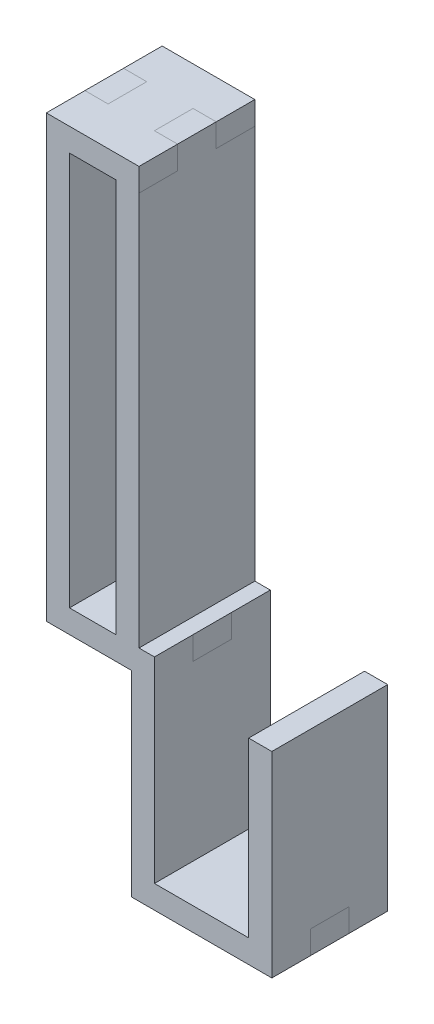
ISO-10303-21;
HEADER;
FILE_DESCRIPTION(('STEP AP214'),'2;1');
FILE_NAME('part.step','',(''),(''),'','','');
FILE_SCHEMA(('AUTOMOTIVE_DESIGN { 1 0 10303 214 1 1 1 1 }'));
ENDSEC;
DATA;
#1=APPLICATION_CONTEXT('core data for automotive mechanical design processes');
#2=APPLICATION_PROTOCOL_DEFINITION('international standard','automotive_design',2000,#1);
#3=PRODUCT_CONTEXT('',#1,'mechanical');
#4=PRODUCT('Part','Part','',(#3));
#5=PRODUCT_RELATED_PRODUCT_CATEGORY('part','',(#4));
#6=PRODUCT_DEFINITION_FORMATION('','',#4);
#7=PRODUCT_DEFINITION_CONTEXT('part definition',#1,'design');
#8=PRODUCT_DEFINITION('design','',#6,#7);
#9=PRODUCT_DEFINITION_SHAPE('','',#8);
#10=(LENGTH_UNIT() NAMED_UNIT(*) SI_UNIT(.MILLI.,.METRE.));
#11=(NAMED_UNIT(*) PLANE_ANGLE_UNIT() SI_UNIT($,.RADIAN.));
#12=(NAMED_UNIT(*) SI_UNIT($,.STERADIAN.) SOLID_ANGLE_UNIT());
#13=UNCERTAINTY_MEASURE_WITH_UNIT(LENGTH_MEASURE(1.E-05),#10,'distance_accuracy_value','');
#14=(GEOMETRIC_REPRESENTATION_CONTEXT(3) GLOBAL_UNCERTAINTY_ASSIGNED_CONTEXT((#13)) GLOBAL_UNIT_ASSIGNED_CONTEXT((#10,
#11,#12)) REPRESENTATION_CONTEXT('',''));
#15=CARTESIAN_POINT('',(0.,0.,0.));
#16=DIRECTION('',(0.,0.,1.));
#17=DIRECTION('',(1.,0.,0.));
#18=AXIS2_PLACEMENT_3D('',#15,#16,#17);
#19=CARTESIAN_POINT('',(75.7,0.,116.3));
#20=DIRECTION('',(1.,0.,0.));
#21=DIRECTION('',(0.,0.,-1.));
#22=AXIS2_PLACEMENT_3D('',#19,#20,#21);
#23=PLANE('',#22);
#24=DIRECTION('',(0.,1.,0.));
#25=VECTOR('',#24,1.);
#26=CARTESIAN_POINT('',(75.7,0.,116.3));
#27=LINE('',#26,#25);
#28=CARTESIAN_POINT('',(75.7,10.4122425773129,116.3));
#29=VERTEX_POINT('',#28);
#30=CARTESIAN_POINT('',(75.7,61.4122425773129,116.3));
#31=VERTEX_POINT('',#30);
#32=EDGE_CURVE('E325',#29,#31,#27,.T.);
#33=ORIENTED_EDGE('',*,*,#32,.T.);
#34=DIRECTION('',(0.,0.,1.));
#35=VECTOR('',#34,1.);
#36=CARTESIAN_POINT('',(75.7,61.4122425773129,116.3));
#37=LINE('',#36,#35);
#38=CARTESIAN_POINT('',(75.7,61.4122425773128,121.3));
#39=VERTEX_POINT('',#38);
#40=EDGE_CURVE('E11',#31,#39,#37,.T.);
#41=ORIENTED_EDGE('',*,*,#40,.T.);
#42=DIRECTION('',(0.,1.,0.));
#43=VECTOR('',#42,1.);
#44=CARTESIAN_POINT('',(75.7,0.,121.3));
#45=LINE('',#44,#43);
#46=CARTESIAN_POINT('',(75.7,64.4122425773129,121.3));
#47=VERTEX_POINT('',#46);
#48=EDGE_CURVE('E47',#39,#47,#45,.T.);
#49=ORIENTED_EDGE('',*,*,#48,.T.);
#50=DIRECTION('',(0.,0.,1.));
#51=VECTOR('',#50,1.);
#52=CARTESIAN_POINT('',(75.7,64.4122425773129,116.3));
#53=LINE('',#52,#51);
#54=CARTESIAN_POINT('',(75.7,64.4122425773129,126.3));
#55=VERTEX_POINT('',#54);
#56=EDGE_CURVE('E413',#47,#55,#53,.T.);
#57=ORIENTED_EDGE('',*,*,#56,.T.);
#58=DIRECTION('',(0.,-1.,0.));
#59=VECTOR('',#58,1.);
#60=CARTESIAN_POINT('',(75.7,0.,126.3));
#61=LINE('',#60,#59);
#62=CARTESIAN_POINT('',(75.7,61.4122425773128,126.3));
#63=VERTEX_POINT('',#62);
#64=EDGE_CURVE('E553',#55,#63,#61,.T.);
#65=ORIENTED_EDGE('',*,*,#64,.T.);
#66=DIRECTION('',(0.,0.,1.));
#67=VECTOR('',#66,1.);
#68=CARTESIAN_POINT('',(75.7,61.4122425773128,116.3));
#69=LINE('',#68,#67);
#70=CARTESIAN_POINT('',(75.7,61.4122425773129,131.3));
#71=VERTEX_POINT('',#70);
#72=EDGE_CURVE('E550',#63,#71,#69,.T.);
#73=ORIENTED_EDGE('',*,*,#72,.T.);
#74=DIRECTION('',(0.,1.,0.));
#75=VECTOR('',#74,1.);
#76=CARTESIAN_POINT('',(75.7,0.,131.3));
#77=LINE('',#76,#75);
#78=CARTESIAN_POINT('',(75.7,10.4122425773129,131.3));
#79=VERTEX_POINT('',#78);
#80=EDGE_CURVE('E369',#79,#71,#77,.T.);
#81=ORIENTED_EDGE('',*,*,#80,.F.);
#82=DIRECTION('',(0.,0.,1.));
#83=VECTOR('',#82,1.);
#84=CARTESIAN_POINT('',(75.7,10.4122425773129,116.3));
#85=LINE('',#84,#83);
#86=EDGE_CURVE('E415',#29,#79,#85,.T.);
#87=ORIENTED_EDGE('',*,*,#86,.F.);
#88=EDGE_LOOP('',(#33,#41,#49,#57,#65,#73,#81,#87));
#89=FACE_BOUND('',#88,.T.);
#90=ADVANCED_FACE('F38',(#89),#23,.T.);
#91=ORIENTED_EDGE('',*,*,#40,.F.);
#92=CARTESIAN_POINT('',(75.7,64.4122425773129,116.3));
#93=VERTEX_POINT('',#92);
#94=EDGE_CURVE('E324',#31,#93,#27,.T.);
#95=ORIENTED_EDGE('',*,*,#94,.T.);
#96=EDGE_CURVE('E410',#93,#47,#53,.T.);
#97=ORIENTED_EDGE('',*,*,#96,.T.);
#98=ORIENTED_EDGE('',*,*,#48,.F.);
#99=EDGE_LOOP('',(#91,#95,#97,#98));
#100=FACE_BOUND('',#99,.T.);
#101=ADVANCED_FACE('F568',(#100),#23,.T.);
#102=CARTESIAN_POINT('',(0.,64.4122425773129,116.3));
#103=DIRECTION('',(0.,1.,0.));
#104=DIRECTION('',(0.,0.,1.));
#105=AXIS2_PLACEMENT_3D('',#102,#103,#104);
#106=PLANE('',#105);
#107=DIRECTION('',(0.,0.,1.));
#108=VECTOR('',#107,1.);
#109=CARTESIAN_POINT('',(66.7,64.4122425773129,116.3));
#110=LINE('',#109,#108);
#111=CARTESIAN_POINT('',(66.7,64.4122425773129,121.3));
#112=VERTEX_POINT('',#111);
#113=CARTESIAN_POINT('',(66.7,64.4122425773129,126.3));
#114=VERTEX_POINT('',#113);
#115=EDGE_CURVE('E543',#112,#114,#110,.T.);
#116=ORIENTED_EDGE('',*,*,#115,.T.);
#117=DIRECTION('',(-1.,0.,0.));
#118=VECTOR('',#117,1.);
#119=CARTESIAN_POINT('',(0.,64.4122425773129,126.3));
#120=LINE('',#119,#118);
#121=CARTESIAN_POINT('',(63.7,64.4122425773129,126.3));
#122=VERTEX_POINT('',#121);
#123=EDGE_CURVE('E547',#114,#122,#120,.T.);
#124=ORIENTED_EDGE('',*,*,#123,.T.);
#125=DIRECTION('',(0.,0.,1.));
#126=VECTOR('',#125,1.);
#127=CARTESIAN_POINT('',(63.7,64.4122425773129,116.3));
#128=LINE('',#127,#126);
#129=CARTESIAN_POINT('',(63.7,64.4122425773129,131.3));
#130=VERTEX_POINT('',#129);
#131=EDGE_CURVE('E409',#122,#130,#128,.T.);
#132=ORIENTED_EDGE('',*,*,#131,.T.);
#133=DIRECTION('',(-1.,0.,0.));
#134=VECTOR('',#133,1.);
#135=CARTESIAN_POINT('',(0.,64.4122425773129,131.3));
#136=LINE('',#135,#134);
#137=CARTESIAN_POINT('',(75.7,64.4122425773129,131.3));
#138=VERTEX_POINT('',#137);
#139=EDGE_CURVE('E372',#138,#130,#136,.T.);
#140=ORIENTED_EDGE('',*,*,#139,.F.);
#141=EDGE_CURVE('E414',#55,#138,#53,.T.);
#142=ORIENTED_EDGE('',*,*,#141,.F.);
#143=DIRECTION('',(-1.,0.,0.));
#144=VECTOR('',#143,1.);
#145=CARTESIAN_POINT('',(0.,64.4122425773129,126.3));
#146=LINE('',#145,#144);
#147=CARTESIAN_POINT('',(72.7,64.4122425773129,126.3));
#148=VERTEX_POINT('',#147);
#149=EDGE_CURVE('E527',#55,#148,#146,.T.);
#150=ORIENTED_EDGE('',*,*,#149,.T.);
#151=DIRECTION('',(0.,0.,-1.));
#152=VECTOR('',#151,1.);
#153=CARTESIAN_POINT('',(72.7,64.4122425773129,116.3));
#154=LINE('',#153,#152);
#155=CARTESIAN_POINT('',(72.7,64.4122425773129,121.3));
#156=VERTEX_POINT('',#155);
#157=EDGE_CURVE('E531',#148,#156,#154,.T.);
#158=ORIENTED_EDGE('',*,*,#157,.T.);
#159=DIRECTION('',(1.,0.,0.));
#160=VECTOR('',#159,1.);
#161=CARTESIAN_POINT('',(0.,64.4122425773129,121.3));
#162=LINE('',#161,#160);
#163=EDGE_CURVE('E535',#156,#47,#162,.T.);
#164=ORIENTED_EDGE('',*,*,#163,.T.);
#165=ORIENTED_EDGE('',*,*,#96,.F.);
#166=DIRECTION('',(-1.,0.,0.));
#167=VECTOR('',#166,1.);
#168=CARTESIAN_POINT('',(0.,64.4122425773129,116.3));
#169=LINE('',#168,#167);
#170=CARTESIAN_POINT('',(63.7,64.4122425773129,116.3));
#171=VERTEX_POINT('',#170);
#172=EDGE_CURVE('E327',#93,#171,#169,.T.);
#173=ORIENTED_EDGE('',*,*,#172,.T.);
#174=CARTESIAN_POINT('',(63.7,64.4122425773129,121.3));
#175=VERTEX_POINT('',#174);
#176=EDGE_CURVE('E405',#171,#175,#128,.T.);
#177=ORIENTED_EDGE('',*,*,#176,.T.);
#178=DIRECTION('',(1.,0.,0.));
#179=VECTOR('',#178,1.);
#180=CARTESIAN_POINT('',(0.,64.4122425773129,121.3));
#181=LINE('',#180,#179);
#182=EDGE_CURVE('E539',#175,#112,#181,.T.);
#183=ORIENTED_EDGE('',*,*,#182,.T.);
#184=EDGE_LOOP('',(#116,#124,#132,#140,#142,#150,#158,#164,#165,#173,#177,#183));
#185=FACE_BOUND('',#184,.T.);
#186=ADVANCED_FACE('F562',(#185),#106,.T.);
#187=ORIENTED_EDGE('',*,*,#123,.F.);
#188=ORIENTED_EDGE('',*,*,#115,.F.);
#189=ORIENTED_EDGE('',*,*,#182,.F.);
#190=EDGE_CURVE('E408',#175,#122,#128,.T.);
#191=ORIENTED_EDGE('',*,*,#190,.T.);
#192=EDGE_LOOP('',(#187,#188,#189,#191));
#193=FACE_BOUND('',#192,.T.);
#194=ADVANCED_FACE('F646',(#193),#106,.T.);
#195=CARTESIAN_POINT('',(63.7,0.,116.3));
#196=DIRECTION('',(1.,0.,0.));
#197=DIRECTION('',(0.,0.,-1.));
#198=AXIS2_PLACEMENT_3D('',#195,#196,#197);
#199=PLANE('',#198);
#200=DIRECTION('',(0.,0.,-1.));
#201=VECTOR('',#200,1.);
#202=CARTESIAN_POINT('',(63.7,10.4122425773129,116.3));
#203=LINE('',#202,#201);
#204=CARTESIAN_POINT('',(63.7,10.4122425773129,131.3));
#205=VERTEX_POINT('',#204);
#206=CARTESIAN_POINT('',(63.7,10.4122425773129,126.3));
#207=VERTEX_POINT('',#206);
#208=EDGE_CURVE('E524',#205,#207,#203,.T.);
#209=ORIENTED_EDGE('',*,*,#208,.F.);
#210=DIRECTION('',(0.,1.,0.));
#211=VECTOR('',#210,1.);
#212=CARTESIAN_POINT('',(63.7,0.,131.3));
#213=LINE('',#212,#211);
#214=CARTESIAN_POINT('',(63.7,61.4122425773129,131.3));
#215=VERTEX_POINT('',#214);
#216=EDGE_CURVE('E380',#205,#215,#213,.T.);
#217=ORIENTED_EDGE('',*,*,#216,.T.);
#218=DIRECTION('',(0.,0.,1.));
#219=VECTOR('',#218,1.);
#220=CARTESIAN_POINT('',(63.7,61.4122425773128,116.3));
#221=LINE('',#220,#219);
#222=CARTESIAN_POINT('',(63.7,61.4122425773128,126.3));
#223=VERTEX_POINT('',#222);
#224=EDGE_CURVE('E501',#223,#215,#221,.T.);
#225=ORIENTED_EDGE('',*,*,#224,.F.);
#226=DIRECTION('',(0.,-1.,0.));
#227=VECTOR('',#226,1.);
#228=CARTESIAN_POINT('',(63.7,0.,126.3));
#229=LINE('',#228,#227);
#230=EDGE_CURVE('E505',#122,#223,#229,.T.);
#231=ORIENTED_EDGE('',*,*,#230,.F.);
#232=ORIENTED_EDGE('',*,*,#190,.F.);
#233=DIRECTION('',(0.,1.,0.));
#234=VECTOR('',#233,1.);
#235=CARTESIAN_POINT('',(63.7,0.,121.3));
#236=LINE('',#235,#234);
#237=CARTESIAN_POINT('',(63.7,61.4122425773128,121.3));
#238=VERTEX_POINT('',#237);
#239=EDGE_CURVE('E508',#238,#175,#236,.T.);
#240=ORIENTED_EDGE('',*,*,#239,.F.);
#241=DIRECTION('',(0.,0.,1.));
#242=VECTOR('',#241,1.);
#243=CARTESIAN_POINT('',(63.7,61.4122425773129,116.3));
#244=LINE('',#243,#242);
#245=CARTESIAN_POINT('',(63.7,61.4122425773129,116.3));
#246=VERTEX_POINT('',#245);
#247=EDGE_CURVE('E512',#246,#238,#244,.T.);
#248=ORIENTED_EDGE('',*,*,#247,.F.);
#249=DIRECTION('',(0.,1.,0.));
#250=VECTOR('',#249,1.);
#251=CARTESIAN_POINT('',(63.7,0.,116.3));
#252=LINE('',#251,#250);
#253=CARTESIAN_POINT('',(63.7,10.4122425773129,116.3));
#254=VERTEX_POINT('',#253);
#255=EDGE_CURVE('E334',#254,#246,#252,.T.);
#256=ORIENTED_EDGE('',*,*,#255,.F.);
#257=DIRECTION('',(0.,0.,-1.));
#258=VECTOR('',#257,1.);
#259=CARTESIAN_POINT('',(63.7,10.4122425773129,116.3));
#260=LINE('',#259,#258);
#261=CARTESIAN_POINT('',(63.7,10.4122425773129,121.3));
#262=VERTEX_POINT('',#261);
#263=EDGE_CURVE('E515',#262,#254,#260,.T.);
#264=ORIENTED_EDGE('',*,*,#263,.F.);
#265=DIRECTION('',(0.,1.,0.));
#266=VECTOR('',#265,1.);
#267=CARTESIAN_POINT('',(63.7,0.,121.3));
#268=LINE('',#267,#266);
#269=CARTESIAN_POINT('',(63.7,7.41224257731286,121.3));
#270=VERTEX_POINT('',#269);
#271=EDGE_CURVE('E518',#270,#262,#268,.T.);
#272=ORIENTED_EDGE('',*,*,#271,.F.);
#273=DIRECTION('',(0.,0.,1.));
#274=VECTOR('',#273,1.);
#275=CARTESIAN_POINT('',(63.7,7.41224257731286,116.3));
#276=LINE('',#275,#274);
#277=CARTESIAN_POINT('',(63.7,7.41224257731286,126.3));
#278=VERTEX_POINT('',#277);
#279=EDGE_CURVE('E403',#270,#278,#276,.T.);
#280=ORIENTED_EDGE('',*,*,#279,.T.);
#281=DIRECTION('',(0.,-1.,0.));
#282=VECTOR('',#281,1.);
#283=CARTESIAN_POINT('',(63.7,0.,126.3));
#284=LINE('',#283,#282);
#285=EDGE_CURVE('E521',#207,#278,#284,.T.);
#286=ORIENTED_EDGE('',*,*,#285,.F.);
#287=EDGE_LOOP('',(#209,#217,#225,#231,#232,#240,#248,#256,#264,#272,#280,#286));
#288=FACE_BOUND('',#287,.T.);
#289=ADVANCED_FACE('F632',(#288),#199,.F.);
#290=CARTESIAN_POINT('',(63.7,7.41224257731286,131.3));
#291=VERTEX_POINT('',#290);
#292=EDGE_CURVE('E376',#291,#205,#213,.T.);
#293=ORIENTED_EDGE('',*,*,#292,.T.);
#294=ORIENTED_EDGE('',*,*,#208,.T.);
#295=ORIENTED_EDGE('',*,*,#285,.T.);
#296=EDGE_CURVE('E404',#278,#291,#276,.T.);
#297=ORIENTED_EDGE('',*,*,#296,.T.);
#298=EDGE_LOOP('',(#293,#294,#295,#297));
#299=FACE_BOUND('',#298,.T.);
#300=ADVANCED_FACE('F830',(#299),#199,.F.);
#301=CARTESIAN_POINT('',(63.7,7.41224257731286,116.3));
#302=VERTEX_POINT('',#301);
#303=EDGE_CURVE('E294',#302,#270,#276,.T.);
#304=ORIENTED_EDGE('',*,*,#303,.T.);
#305=ORIENTED_EDGE('',*,*,#271,.T.);
#306=ORIENTED_EDGE('',*,*,#263,.T.);
#307=EDGE_CURVE('E331',#302,#254,#252,.T.);
#308=ORIENTED_EDGE('',*,*,#307,.F.);
#309=EDGE_LOOP('',(#304,#305,#306,#308));
#310=FACE_BOUND('',#309,.T.);
#311=ADVANCED_FACE('F636',(#310),#199,.F.);
#312=EDGE_CURVE('E330',#246,#171,#252,.T.);
#313=ORIENTED_EDGE('',*,*,#312,.F.);
#314=ORIENTED_EDGE('',*,*,#247,.T.);
#315=ORIENTED_EDGE('',*,*,#239,.T.);
#316=ORIENTED_EDGE('',*,*,#176,.F.);
#317=EDGE_LOOP('',(#313,#314,#315,#316));
#318=FACE_BOUND('',#317,.T.);
#319=ADVANCED_FACE('F643',(#318),#199,.F.);
#320=CARTESIAN_POINT('',(0.,-17.9877574226871,116.3));
#321=DIRECTION('',(0.,-1.,0.));
#322=DIRECTION('',(0.,0.,-1.));
#323=AXIS2_PLACEMENT_3D('',#320,#321,#322);
#324=PLANE('',#323);
#325=DIRECTION('',(0.,0.,-1.));
#326=VECTOR('',#325,1.);
#327=CARTESIAN_POINT('',(77.7,-17.9877574226871,116.3));
#328=LINE('',#327,#326);
#329=CARTESIAN_POINT('',(77.7,-17.9877574226871,131.3));
#330=VERTEX_POINT('',#329);
#331=CARTESIAN_POINT('',(77.7,-17.9877574226871,126.3));
#332=VERTEX_POINT('',#331);
#333=EDGE_CURVE('E494',#330,#332,#328,.T.);
#334=ORIENTED_EDGE('',*,*,#333,.T.);
#335=DIRECTION('',(-1.,0.,0.));
#336=VECTOR('',#335,1.);
#337=CARTESIAN_POINT('',(0.,-17.9877574226871,126.3));
#338=LINE('',#337,#336);
#339=CARTESIAN_POINT('',(74.7,-17.9877574226871,126.3));
#340=VERTEX_POINT('',#339);
#341=EDGE_CURVE('E498',#332,#340,#338,.T.);
#342=ORIENTED_EDGE('',*,*,#341,.T.);
#343=DIRECTION('',(0.,0.,1.));
#344=VECTOR('',#343,1.);
#345=CARTESIAN_POINT('',(74.7,-17.9877574226871,116.3));
#346=LINE('',#345,#344);
#347=CARTESIAN_POINT('',(74.7,-17.9877574226871,121.3));
#348=VERTEX_POINT('',#347);
#349=EDGE_CURVE('E438',#348,#340,#346,.T.);
#350=ORIENTED_EDGE('',*,*,#349,.F.);
#351=DIRECTION('',(1.,0.,0.));
#352=VECTOR('',#351,1.);
#353=CARTESIAN_POINT('',(0.,-17.9877574226871,121.3));
#354=LINE('',#353,#352);
#355=CARTESIAN_POINT('',(77.7,-17.9877574226871,121.3));
#356=VERTEX_POINT('',#355);
#357=EDGE_CURVE('E487',#348,#356,#354,.T.);
#358=ORIENTED_EDGE('',*,*,#357,.T.);
#359=DIRECTION('',(0.,0.,-1.));
#360=VECTOR('',#359,1.);
#361=CARTESIAN_POINT('',(77.7,-17.9877574226871,116.3));
#362=LINE('',#361,#360);
#363=CARTESIAN_POINT('',(77.7,-17.9877574226871,116.3));
#364=VERTEX_POINT('',#363);
#365=EDGE_CURVE('E491',#356,#364,#362,.T.);
#366=ORIENTED_EDGE('',*,*,#365,.T.);
#367=DIRECTION('',(1.,0.,0.));
#368=VECTOR('',#367,1.);
#369=CARTESIAN_POINT('',(0.,-17.9877574226871,116.3));
#370=LINE('',#369,#368);
#371=CARTESIAN_POINT('',(89.9,-17.9877574226871,116.3));
#372=VERTEX_POINT('',#371);
#373=EDGE_CURVE('E307',#364,#372,#370,.T.);
#374=ORIENTED_EDGE('',*,*,#373,.T.);
#375=DIRECTION('',(0.,0.,1.));
#376=VECTOR('',#375,1.);
#377=CARTESIAN_POINT('',(89.9,-17.9877574226871,116.3));
#378=LINE('',#377,#376);
#379=CARTESIAN_POINT('',(89.9,-17.9877574226871,121.3));
#380=VERTEX_POINT('',#379);
#381=EDGE_CURVE('E480',#372,#380,#378,.T.);
#382=ORIENTED_EDGE('',*,*,#381,.T.);
#383=DIRECTION('',(1.,0.,0.));
#384=VECTOR('',#383,1.);
#385=CARTESIAN_POINT('',(0.,-17.9877574226871,121.3));
#386=LINE('',#385,#384);
#387=CARTESIAN_POINT('',(92.9,-17.9877574226871,121.3));
#388=VERTEX_POINT('',#387);
#389=EDGE_CURVE('E484',#380,#388,#386,.T.);
#390=ORIENTED_EDGE('',*,*,#389,.T.);
#391=DIRECTION('',(0.,0.,1.));
#392=VECTOR('',#391,1.);
#393=CARTESIAN_POINT('',(92.9,-17.9877574226871,116.3));
#394=LINE('',#393,#392);
#395=CARTESIAN_POINT('',(92.9,-17.9877574226871,126.3));
#396=VERTEX_POINT('',#395);
#397=EDGE_CURVE('E435',#388,#396,#394,.T.);
#398=ORIENTED_EDGE('',*,*,#397,.T.);
#399=DIRECTION('',(-1.,0.,0.));
#400=VECTOR('',#399,1.);
#401=CARTESIAN_POINT('',(0.,-17.9877574226871,126.3));
#402=LINE('',#401,#400);
#403=CARTESIAN_POINT('',(89.9,-17.9877574226871,126.3));
#404=VERTEX_POINT('',#403);
#405=EDGE_CURVE('E472',#396,#404,#402,.T.);
#406=ORIENTED_EDGE('',*,*,#405,.T.);
#407=DIRECTION('',(0.,0.,1.));
#408=VECTOR('',#407,1.);
#409=CARTESIAN_POINT('',(89.9,-17.9877574226871,116.3));
#410=LINE('',#409,#408);
#411=CARTESIAN_POINT('',(89.9,-17.9877574226871,131.3));
#412=VERTEX_POINT('',#411);
#413=EDGE_CURVE('E476',#404,#412,#410,.T.);
#414=ORIENTED_EDGE('',*,*,#413,.T.);
#415=DIRECTION('',(1.,0.,0.));
#416=VECTOR('',#415,1.);
#417=CARTESIAN_POINT('',(0.,-17.9877574226871,131.3));
#418=LINE('',#417,#416);
#419=EDGE_CURVE('E352',#330,#412,#418,.T.);
#420=ORIENTED_EDGE('',*,*,#419,.F.);
#421=EDGE_LOOP('',(#334,#342,#350,#358,#366,#374,#382,#390,#398,#406,#414,#420));
#422=FACE_BOUND('',#421,.T.);
#423=ADVANCED_FACE('F616',(#422),#324,.T.);
#424=ORIENTED_EDGE('',*,*,#341,.F.);
#425=ORIENTED_EDGE('',*,*,#333,.F.);
#426=CARTESIAN_POINT('',(74.7,-17.9877574226871,131.3));
#427=VERTEX_POINT('',#426);
#428=EDGE_CURVE('E348',#427,#330,#418,.T.);
#429=ORIENTED_EDGE('',*,*,#428,.F.);
#430=EDGE_CURVE('E286',#340,#427,#346,.T.);
#431=ORIENTED_EDGE('',*,*,#430,.F.);
#432=EDGE_LOOP('',(#424,#425,#429,#431));
#433=FACE_BOUND('',#432,.T.);
#434=ADVANCED_FACE('F620',(#433),#324,.T.);
#435=ORIENTED_EDGE('',*,*,#365,.F.);
#436=ORIENTED_EDGE('',*,*,#357,.F.);
#437=CARTESIAN_POINT('',(74.7,-17.9877574226871,116.3));
#438=VERTEX_POINT('',#437);
#439=EDGE_CURVE('E437',#438,#348,#346,.T.);
#440=ORIENTED_EDGE('',*,*,#439,.F.);
#441=EDGE_CURVE('E304',#438,#364,#370,.T.);
#442=ORIENTED_EDGE('',*,*,#441,.T.);
#443=EDGE_LOOP('',(#435,#436,#440,#442));
#444=FACE_BOUND('',#443,.T.);
#445=ADVANCED_FACE('F610',(#444),#324,.T.);
#446=ORIENTED_EDGE('',*,*,#389,.F.);
#447=ORIENTED_EDGE('',*,*,#381,.F.);
#448=CARTESIAN_POINT('',(92.9,-17.9877574226871,116.3));
#449=VERTEX_POINT('',#448);
#450=EDGE_CURVE('E305',#372,#449,#370,.T.);
#451=ORIENTED_EDGE('',*,*,#450,.T.);
#452=EDGE_CURVE('E432',#449,#388,#394,.T.);
#453=ORIENTED_EDGE('',*,*,#452,.T.);
#454=EDGE_LOOP('',(#446,#447,#451,#453));
#455=FACE_BOUND('',#454,.T.);
#456=ADVANCED_FACE('F606',(#455),#324,.T.);
#457=CARTESIAN_POINT('',(92.9,0.,116.3));
#458=DIRECTION('',(1.,0.,0.));
#459=DIRECTION('',(0.,0.,-1.));
#460=AXIS2_PLACEMENT_3D('',#457,#458,#459);
#461=PLANE('',#460);
#462=CARTESIAN_POINT('',(92.9,-17.9877574226871,131.3));
#463=VERTEX_POINT('',#462);
#464=EDGE_CURVE('E436',#396,#463,#394,.T.);
#465=ORIENTED_EDGE('',*,*,#464,.F.);
#466=DIRECTION('',(0.,1.,0.));
#467=VECTOR('',#466,1.);
#468=CARTESIAN_POINT('',(92.9,0.,126.3));
#469=LINE('',#468,#467);
#470=CARTESIAN_POINT('',(92.9,-14.9877574226871,126.3));
#471=VERTEX_POINT('',#470);
#472=EDGE_CURVE('E469',#396,#471,#469,.T.);
#473=ORIENTED_EDGE('',*,*,#472,.T.);
#474=DIRECTION('',(0.,0.,-1.));
#475=VECTOR('',#474,1.);
#476=CARTESIAN_POINT('',(92.9,-14.9877574226871,116.3));
#477=LINE('',#476,#475);
#478=CARTESIAN_POINT('',(92.9,-14.9877574226871,121.3));
#479=VERTEX_POINT('',#478);
#480=EDGE_CURVE('E461',#471,#479,#477,.T.);
#481=ORIENTED_EDGE('',*,*,#480,.T.);
#482=DIRECTION('',(0.,-1.,0.));
#483=VECTOR('',#482,1.);
#484=CARTESIAN_POINT('',(92.9,0.,121.3));
#485=LINE('',#484,#483);
#486=EDGE_CURVE('E465',#479,#388,#485,.T.);
#487=ORIENTED_EDGE('',*,*,#486,.T.);
#488=ORIENTED_EDGE('',*,*,#452,.F.);
#489=DIRECTION('',(0.,1.,0.));
#490=VECTOR('',#489,1.);
#491=CARTESIAN_POINT('',(92.9,0.,116.3));
#492=LINE('',#491,#490);
#493=CARTESIAN_POINT('',(92.9,7.41224257731285,116.3));
#494=VERTEX_POINT('',#493);
#495=EDGE_CURVE('E310',#449,#494,#492,.T.);
#496=ORIENTED_EDGE('',*,*,#495,.T.);
#497=DIRECTION('',(0.,0.,1.));
#498=VECTOR('',#497,1.);
#499=CARTESIAN_POINT('',(92.9,7.41224257731285,116.3));
#500=LINE('',#499,#498);
#501=CARTESIAN_POINT('',(92.9,7.41224257731285,131.3));
#502=VERTEX_POINT('',#501);
#503=EDGE_CURVE('E430',#494,#502,#500,.T.);
#504=ORIENTED_EDGE('',*,*,#503,.T.);
#505=DIRECTION('',(0.,1.,0.));
#506=VECTOR('',#505,1.);
#507=CARTESIAN_POINT('',(92.9,0.,131.3));
#508=LINE('',#507,#506);
#509=EDGE_CURVE('E351',#463,#502,#508,.T.);
#510=ORIENTED_EDGE('',*,*,#509,.F.);
#511=EDGE_LOOP('',(#465,#473,#481,#487,#488,#496,#504,#510));
#512=FACE_BOUND('',#511,.T.);
#513=ADVANCED_FACE('F603',(#512),#461,.T.);
#514=CARTESIAN_POINT('',(77.7,0.,116.3));
#515=DIRECTION('',(-1.,0.,0.));
#516=DIRECTION('',(0.,-1.,0.));
#517=AXIS2_PLACEMENT_3D('',#514,#515,#516);
#518=PLANE('',#517);
#519=DIRECTION('',(0.,1.,0.));
#520=VECTOR('',#519,1.);
#521=CARTESIAN_POINT('',(77.7,0.,121.3));
#522=LINE('',#521,#520);
#523=CARTESIAN_POINT('',(77.7,7.41224257731285,121.3));
#524=VERTEX_POINT('',#523);
#525=CARTESIAN_POINT('',(77.7,10.4122425773129,121.3));
#526=VERTEX_POINT('',#525);
#527=EDGE_CURVE('E458',#524,#526,#522,.T.);
#528=ORIENTED_EDGE('',*,*,#527,.F.);
#529=DIRECTION('',(0.,0.,-1.));
#530=VECTOR('',#529,1.);
#531=CARTESIAN_POINT('',(77.7,7.41224257731285,116.3));
#532=LINE('',#531,#530);
#533=CARTESIAN_POINT('',(77.7,7.41224257731285,126.3));
#534=VERTEX_POINT('',#533);
#535=EDGE_CURVE('E454',#534,#524,#532,.T.);
#536=ORIENTED_EDGE('',*,*,#535,.F.);
#537=DIRECTION('',(0.,-1.,0.));
#538=VECTOR('',#537,1.);
#539=CARTESIAN_POINT('',(77.7,0.,126.3));
#540=LINE('',#539,#538);
#541=CARTESIAN_POINT('',(77.7,10.4122425773129,126.3));
#542=VERTEX_POINT('',#541);
#543=EDGE_CURVE('E448',#542,#534,#540,.T.);
#544=ORIENTED_EDGE('',*,*,#543,.F.);
#545=DIRECTION('',(0.,0.,1.));
#546=VECTOR('',#545,1.);
#547=CARTESIAN_POINT('',(77.7,10.4122425773129,116.3));
#548=LINE('',#547,#546);
#549=CARTESIAN_POINT('',(77.7,10.4122425773129,131.3));
#550=VERTEX_POINT('',#549);
#551=EDGE_CURVE('E421',#542,#550,#548,.T.);
#552=ORIENTED_EDGE('',*,*,#551,.T.);
#553=DIRECTION('',(0.,-1.,0.));
#554=VECTOR('',#553,1.);
#555=CARTESIAN_POINT('',(77.7,0.,131.3));
#556=LINE('',#555,#554);
#557=CARTESIAN_POINT('',(77.7,-14.9877574226871,131.3));
#558=VERTEX_POINT('',#557);
#559=EDGE_CURVE('E362',#550,#558,#556,.T.);
#560=ORIENTED_EDGE('',*,*,#559,.T.);
#561=DIRECTION('',(0.,0.,1.));
#562=VECTOR('',#561,1.);
#563=CARTESIAN_POINT('',(77.7,-14.9877574226871,116.3));
#564=LINE('',#563,#562);
#565=CARTESIAN_POINT('',(77.7,-14.9877574226871,116.3));
#566=VERTEX_POINT('',#565);
#567=EDGE_CURVE('E422',#566,#558,#564,.T.);
#568=ORIENTED_EDGE('',*,*,#567,.F.);
#569=DIRECTION('',(0.,-1.,0.));
#570=VECTOR('',#569,1.);
#571=CARTESIAN_POINT('',(77.7,0.,116.3));
#572=LINE('',#571,#570);
#573=CARTESIAN_POINT('',(77.7,10.4122425773129,116.3));
#574=VERTEX_POINT('',#573);
#575=EDGE_CURVE('E319',#574,#566,#572,.T.);
#576=ORIENTED_EDGE('',*,*,#575,.F.);
#577=EDGE_CURVE('E417',#574,#526,#548,.T.);
#578=ORIENTED_EDGE('',*,*,#577,.T.);
#579=EDGE_LOOP('',(#528,#536,#544,#552,#560,#568,#576,#578));
#580=FACE_BOUND('',#579,.T.);
#581=ADVANCED_FACE('F582',(#580),#518,.F.);
#582=CARTESIAN_POINT('',(74.7,0.,116.3));
#583=DIRECTION('',(-1.,0.,0.));
#584=DIRECTION('',(0.,0.,1.));
#585=AXIS2_PLACEMENT_3D('',#582,#583,#584);
#586=PLANE('',#585);
#587=DIRECTION('',(0.,0.,1.));
#588=VECTOR('',#587,1.);
#589=CARTESIAN_POINT('',(74.7,-14.9877574226871,116.3));
#590=LINE('',#589,#588);
#591=CARTESIAN_POINT('',(74.7,-14.9877574226871,121.3));
#592=VERTEX_POINT('',#591);
#593=CARTESIAN_POINT('',(74.7,-14.9877574226871,126.3));
#594=VERTEX_POINT('',#593);
#595=EDGE_CURVE('E443',#592,#594,#590,.T.);
#596=ORIENTED_EDGE('',*,*,#595,.T.);
#597=DIRECTION('',(0.,-1.,0.));
#598=VECTOR('',#597,1.);
#599=CARTESIAN_POINT('',(74.7,0.,126.3));
#600=LINE('',#599,#598);
#601=EDGE_CURVE('E444',#594,#340,#600,.T.);
#602=ORIENTED_EDGE('',*,*,#601,.T.);
#603=ORIENTED_EDGE('',*,*,#430,.T.);
#604=DIRECTION('',(0.,-1.,0.));
#605=VECTOR('',#604,1.);
#606=CARTESIAN_POINT('',(74.7,0.,131.3));
#607=LINE('',#606,#605);
#608=CARTESIAN_POINT('',(74.7,7.41224257731286,131.3));
#609=VERTEX_POINT('',#608);
#610=EDGE_CURVE('E282',#609,#427,#607,.T.);
#611=ORIENTED_EDGE('',*,*,#610,.F.);
#612=DIRECTION('',(0.,0.,1.));
#613=VECTOR('',#612,1.);
#614=CARTESIAN_POINT('',(74.7,7.41224257731286,116.3));
#615=LINE('',#614,#613);
#616=CARTESIAN_POINT('',(74.7,7.41224257731286,116.3));
#617=VERTEX_POINT('',#616);
#618=EDGE_CURVE('E274',#617,#609,#615,.T.);
#619=ORIENTED_EDGE('',*,*,#618,.F.);
#620=DIRECTION('',(0.,-1.,0.));
#621=VECTOR('',#620,1.);
#622=CARTESIAN_POINT('',(74.7,0.,116.3));
#623=LINE('',#622,#621);
#624=EDGE_CURVE('E280',#617,#438,#623,.T.);
#625=ORIENTED_EDGE('',*,*,#624,.T.);
#626=ORIENTED_EDGE('',*,*,#439,.T.);
#627=DIRECTION('',(0.,1.,0.));
#628=VECTOR('',#627,1.);
#629=CARTESIAN_POINT('',(74.7,0.,121.3));
#630=LINE('',#629,#628);
#631=EDGE_CURVE('E393',#348,#592,#630,.T.);
#632=ORIENTED_EDGE('',*,*,#631,.T.);
#633=EDGE_LOOP('',(#596,#602,#603,#611,#619,#625,#626,#632));
#634=FACE_BOUND('',#633,.T.);
#635=ADVANCED_FACE('F277',(#634),#586,.T.);
#636=CARTESIAN_POINT('',(0.,10.4122425773128,116.3));
#637=DIRECTION('',(0.,1.,0.));
#638=DIRECTION('',(-1.,0.,0.));
#639=AXIS2_PLACEMENT_3D('',#636,#637,#638);
#640=PLANE('',#639);
#641=DIRECTION('',(-1.,0.,0.));
#642=VECTOR('',#641,1.);
#643=CARTESIAN_POINT('',(0.,10.4122425773128,131.3));
#644=LINE('',#643,#642);
#645=CARTESIAN_POINT('',(72.7,10.4122425773129,131.3));
#646=VERTEX_POINT('',#645);
#647=CARTESIAN_POINT('',(66.7,10.4122425773129,131.3));
#648=VERTEX_POINT('',#647);
#649=EDGE_CURVE('E379',#646,#648,#644,.T.);
#650=ORIENTED_EDGE('',*,*,#649,.F.);
#651=DIRECTION('',(0.,0.,1.));
#652=VECTOR('',#651,1.);
#653=CARTESIAN_POINT('',(72.7,10.4122425773129,116.3));
#654=LINE('',#653,#652);
#655=CARTESIAN_POINT('',(72.7,10.4122425773129,116.3));
#656=VERTEX_POINT('',#655);
#657=EDGE_CURVE('E391',#656,#646,#654,.T.);
#658=ORIENTED_EDGE('',*,*,#657,.F.);
#659=DIRECTION('',(-1.,0.,0.));
#660=VECTOR('',#659,1.);
#661=CARTESIAN_POINT('',(0.,10.4122425773128,116.3));
#662=LINE('',#661,#660);
#663=CARTESIAN_POINT('',(66.7,10.4122425773129,116.3));
#664=VERTEX_POINT('',#663);
#665=EDGE_CURVE('E333',#656,#664,#662,.T.);
#666=ORIENTED_EDGE('',*,*,#665,.T.);
#667=DIRECTION('',(0.,0.,1.));
#668=VECTOR('',#667,1.);
#669=CARTESIAN_POINT('',(66.7,10.4122425773129,116.3));
#670=LINE('',#669,#668);
#671=EDGE_CURVE('E400',#664,#648,#670,.T.);
#672=ORIENTED_EDGE('',*,*,#671,.T.);
#673=EDGE_LOOP('',(#650,#658,#666,#672));
#674=FACE_BOUND('',#673,.T.);
#675=ADVANCED_FACE('F680',(#674),#640,.T.);
#676=CARTESIAN_POINT('',(72.7,0.,116.3));
#677=DIRECTION('',(1.,0.,0.));
#678=DIRECTION('',(0.,0.,-1.));
#679=AXIS2_PLACEMENT_3D('',#676,#677,#678);
#680=PLANE('',#679);
#681=DIRECTION('',(0.,1.,0.));
#682=VECTOR('',#681,1.);
#683=CARTESIAN_POINT('',(72.7,0.,131.3));
#684=LINE('',#683,#682);
#685=CARTESIAN_POINT('',(72.7,61.4122425773129,131.3));
#686=VERTEX_POINT('',#685);
#687=EDGE_CURVE('E297',#646,#686,#684,.T.);
#688=ORIENTED_EDGE('',*,*,#687,.T.);
#689=DIRECTION('',(0.,0.,1.));
#690=VECTOR('',#689,1.);
#691=CARTESIAN_POINT('',(72.7,61.4122425773129,116.3));
#692=LINE('',#691,#690);
#693=CARTESIAN_POINT('',(72.7,61.4122425773129,116.3));
#694=VERTEX_POINT('',#693);
#695=EDGE_CURVE('E394',#694,#686,#692,.T.);
#696=ORIENTED_EDGE('',*,*,#695,.F.);
#697=DIRECTION('',(0.,1.,0.));
#698=VECTOR('',#697,1.);
#699=CARTESIAN_POINT('',(72.7,0.,116.3));
#700=LINE('',#699,#698);
#701=EDGE_CURVE('E287',#656,#694,#700,.T.);
#702=ORIENTED_EDGE('',*,*,#701,.F.);
#703=ORIENTED_EDGE('',*,*,#657,.T.);
#704=EDGE_LOOP('',(#688,#696,#702,#703));
#705=FACE_BOUND('',#704,.T.);
#706=ADVANCED_FACE('F683',(#705),#680,.F.);
#707=CARTESIAN_POINT('',(0.,61.4122425773129,116.3));
#708=DIRECTION('',(0.,1.,0.));
#709=DIRECTION('',(0.,0.,1.));
#710=AXIS2_PLACEMENT_3D('',#707,#708,#709);
#711=PLANE('',#710);
#712=DIRECTION('',(-1.,0.,0.));
#713=VECTOR('',#712,1.);
#714=CARTESIAN_POINT('',(0.,61.4122425773129,131.3));
#715=LINE('',#714,#713);
#716=CARTESIAN_POINT('',(66.7,61.4122425773129,131.3));
#717=VERTEX_POINT('',#716);
#718=EDGE_CURVE('E386',#686,#717,#715,.T.);
#719=ORIENTED_EDGE('',*,*,#718,.T.);
#720=DIRECTION('',(0.,0.,1.));
#721=VECTOR('',#720,1.);
#722=CARTESIAN_POINT('',(66.7,61.4122425773129,116.3));
#723=LINE('',#722,#721);
#724=CARTESIAN_POINT('',(66.7,61.4122425773129,116.3));
#725=VERTEX_POINT('',#724);
#726=EDGE_CURVE('E397',#725,#717,#723,.T.);
#727=ORIENTED_EDGE('',*,*,#726,.F.);
#728=DIRECTION('',(-1.,0.,0.));
#729=VECTOR('',#728,1.);
#730=CARTESIAN_POINT('',(0.,61.4122425773129,116.3));
#731=LINE('',#730,#729);
#732=EDGE_CURVE('E339',#694,#725,#731,.T.);
#733=ORIENTED_EDGE('',*,*,#732,.F.);
#734=ORIENTED_EDGE('',*,*,#695,.T.);
#735=EDGE_LOOP('',(#719,#727,#733,#734));
#736=FACE_BOUND('',#735,.T.);
#737=ADVANCED_FACE('F689',(#736),#711,.F.);
#738=CARTESIAN_POINT('',(0.,7.41224257731284,116.3));
#739=DIRECTION('',(0.,1.,0.));
#740=DIRECTION('',(-1.,0.,0.));
#741=AXIS2_PLACEMENT_3D('',#738,#739,#740);
#742=PLANE('',#741);
#743=DIRECTION('',(-1.,0.,0.));
#744=VECTOR('',#743,1.);
#745=CARTESIAN_POINT('',(0.,7.41224257731284,131.3));
#746=LINE('',#745,#744);
#747=EDGE_CURVE('E344',#609,#291,#746,.T.);
#748=ORIENTED_EDGE('',*,*,#747,.T.);
#749=ORIENTED_EDGE('',*,*,#296,.F.);
#750=ORIENTED_EDGE('',*,*,#279,.F.);
#751=ORIENTED_EDGE('',*,*,#303,.F.);
#752=DIRECTION('',(-1.,0.,0.));
#753=VECTOR('',#752,1.);
#754=CARTESIAN_POINT('',(0.,7.41224257731284,116.3));
#755=LINE('',#754,#753);
#756=EDGE_CURVE('E291',#617,#302,#755,.T.);
#757=ORIENTED_EDGE('',*,*,#756,.F.);
#758=ORIENTED_EDGE('',*,*,#618,.T.);
#759=EDGE_LOOP('',(#748,#749,#750,#751,#757,#758));
#760=FACE_BOUND('',#759,.T.);
#761=ADVANCED_FACE('F40',(#760),#742,.F.);
#762=ORIENTED_EDGE('',*,*,#131,.F.);
#763=ORIENTED_EDGE('',*,*,#230,.T.);
#764=ORIENTED_EDGE('',*,*,#224,.T.);
#765=EDGE_CURVE('E375',#215,#130,#213,.T.);
#766=ORIENTED_EDGE('',*,*,#765,.T.);
#767=EDGE_LOOP('',(#762,#763,#764,#766));
#768=FACE_BOUND('',#767,.T.);
#769=ADVANCED_FACE('F653',(#768),#199,.F.);
#770=ORIENTED_EDGE('',*,*,#163,.F.);
#771=ORIENTED_EDGE('',*,*,#157,.F.);
#772=ORIENTED_EDGE('',*,*,#149,.F.);
#773=ORIENTED_EDGE('',*,*,#56,.F.);
#774=EDGE_LOOP('',(#770,#771,#772,#773));
#775=FACE_BOUND('',#774,.T.);
#776=ADVANCED_FACE('F566',(#775),#106,.T.);
#777=ORIENTED_EDGE('',*,*,#64,.F.);
#778=ORIENTED_EDGE('',*,*,#141,.T.);
#779=EDGE_CURVE('E368',#71,#138,#77,.T.);
#780=ORIENTED_EDGE('',*,*,#779,.F.);
#781=ORIENTED_EDGE('',*,*,#72,.F.);
#782=EDGE_LOOP('',(#777,#778,#780,#781));
#783=FACE_BOUND('',#782,.T.);
#784=ADVANCED_FACE('F659',(#783),#23,.T.);
#785=CARTESIAN_POINT('',(0.,10.412242577313,116.3));
#786=DIRECTION('',(0.,1.,0.));
#787=DIRECTION('',(-1.,0.,0.));
#788=AXIS2_PLACEMENT_3D('',#785,#786,#787);
#789=PLANE('',#788);
#790=DIRECTION('',(-1.,0.,0.));
#791=VECTOR('',#790,1.);
#792=CARTESIAN_POINT('',(0.,10.412242577313,131.3));
#793=LINE('',#792,#791);
#794=EDGE_CURVE('E365',#550,#79,#793,.T.);
#795=ORIENTED_EDGE('',*,*,#794,.F.);
#796=ORIENTED_EDGE('',*,*,#551,.F.);
#797=EDGE_CURVE('E420',#526,#542,#548,.T.);
#798=ORIENTED_EDGE('',*,*,#797,.F.);
#799=ORIENTED_EDGE('',*,*,#577,.F.);
#800=DIRECTION('',(-1.,0.,0.));
#801=VECTOR('',#800,1.);
#802=CARTESIAN_POINT('',(0.,10.412242577313,116.3));
#803=LINE('',#802,#801);
#804=EDGE_CURVE('E321',#574,#29,#803,.T.);
#805=ORIENTED_EDGE('',*,*,#804,.T.);
#806=ORIENTED_EDGE('',*,*,#86,.T.);
#807=EDGE_LOOP('',(#795,#796,#798,#799,#805,#806));
#808=FACE_BOUND('',#807,.T.);
#809=ADVANCED_FACE('F574',(#808),#789,.T.);
#810=ORIENTED_EDGE('',*,*,#535,.T.);
#811=ORIENTED_EDGE('',*,*,#527,.T.);
#812=ORIENTED_EDGE('',*,*,#797,.T.);
#813=ORIENTED_EDGE('',*,*,#543,.T.);
#814=EDGE_LOOP('',(#810,#811,#812,#813));
#815=FACE_BOUND('',#814,.T.);
#816=ADVANCED_FACE('F666',(#815),#518,.F.);
#817=CARTESIAN_POINT('',(0.,-14.9877574226871,116.3));
#818=DIRECTION('',(0.,-1.,0.));
#819=DIRECTION('',(1.,0.,0.));
#820=AXIS2_PLACEMENT_3D('',#817,#818,#819);
#821=PLANE('',#820);
#822=DIRECTION('',(1.,0.,0.));
#823=VECTOR('',#822,1.);
#824=CARTESIAN_POINT('',(0.,-14.9877574226871,131.3));
#825=LINE('',#824,#823);
#826=CARTESIAN_POINT('',(89.9,-14.9877574226871,131.3));
#827=VERTEX_POINT('',#826);
#828=EDGE_CURVE('E360',#558,#827,#825,.T.);
#829=ORIENTED_EDGE('',*,*,#828,.T.);
#830=DIRECTION('',(0.,0.,1.));
#831=VECTOR('',#830,1.);
#832=CARTESIAN_POINT('',(89.9,-14.9877574226871,116.3));
#833=LINE('',#832,#831);
#834=CARTESIAN_POINT('',(89.9,-14.9877574226871,116.3));
#835=VERTEX_POINT('',#834);
#836=EDGE_CURVE('E424',#835,#827,#833,.T.);
#837=ORIENTED_EDGE('',*,*,#836,.F.);
#838=DIRECTION('',(1.,0.,0.));
#839=VECTOR('',#838,1.);
#840=CARTESIAN_POINT('',(0.,-14.9877574226871,116.3));
#841=LINE('',#840,#839);
#842=EDGE_CURVE('E317',#566,#835,#841,.T.);
#843=ORIENTED_EDGE('',*,*,#842,.F.);
#844=ORIENTED_EDGE('',*,*,#567,.T.);
#845=EDGE_LOOP('',(#829,#837,#843,#844));
#846=FACE_BOUND('',#845,.T.);
#847=ADVANCED_FACE('F586',(#846),#821,.F.);
#848=CARTESIAN_POINT('',(89.9,0.,116.3));
#849=DIRECTION('',(1.,0.,0.));
#850=DIRECTION('',(0.,1.,0.));
#851=AXIS2_PLACEMENT_3D('',#848,#849,#850);
#852=PLANE('',#851);
#853=DIRECTION('',(0.,1.,0.));
#854=VECTOR('',#853,1.);
#855=CARTESIAN_POINT('',(89.9,0.,131.3));
#856=LINE('',#855,#854);
#857=CARTESIAN_POINT('',(89.9,7.41224257731285,131.3));
#858=VERTEX_POINT('',#857);
#859=EDGE_CURVE('E358',#827,#858,#856,.T.);
#860=ORIENTED_EDGE('',*,*,#859,.T.);
#861=DIRECTION('',(0.,0.,1.));
#862=VECTOR('',#861,1.);
#863=CARTESIAN_POINT('',(89.9,7.41224257731285,116.3));
#864=LINE('',#863,#862);
#865=CARTESIAN_POINT('',(89.9,7.41224257731285,116.3));
#866=VERTEX_POINT('',#865);
#867=EDGE_CURVE('E427',#866,#858,#864,.T.);
#868=ORIENTED_EDGE('',*,*,#867,.F.);
#869=DIRECTION('',(0.,1.,0.));
#870=VECTOR('',#869,1.);
#871=CARTESIAN_POINT('',(89.9,0.,116.3));
#872=LINE('',#871,#870);
#873=EDGE_CURVE('E315',#835,#866,#872,.T.);
#874=ORIENTED_EDGE('',*,*,#873,.F.);
#875=ORIENTED_EDGE('',*,*,#836,.T.);
#876=EDGE_LOOP('',(#860,#868,#874,#875));
#877=FACE_BOUND('',#876,.T.);
#878=ADVANCED_FACE('F591',(#877),#852,.F.);
#879=CARTESIAN_POINT('',(0.,7.41224257731288,116.3));
#880=DIRECTION('',(0.,-1.,0.));
#881=DIRECTION('',(1.,0.,0.));
#882=AXIS2_PLACEMENT_3D('',#879,#880,#881);
#883=PLANE('',#882);
#884=DIRECTION('',(1.,0.,0.));
#885=VECTOR('',#884,1.);
#886=CARTESIAN_POINT('',(0.,7.41224257731288,131.3));
#887=LINE('',#886,#885);
#888=EDGE_CURVE('E355',#858,#502,#887,.T.);
#889=ORIENTED_EDGE('',*,*,#888,.T.);
#890=ORIENTED_EDGE('',*,*,#503,.F.);
#891=DIRECTION('',(1.,0.,0.));
#892=VECTOR('',#891,1.);
#893=CARTESIAN_POINT('',(0.,7.41224257731288,116.3));
#894=LINE('',#893,#892);
#895=EDGE_CURVE('E313',#866,#494,#894,.T.);
#896=ORIENTED_EDGE('',*,*,#895,.F.);
#897=ORIENTED_EDGE('',*,*,#867,.T.);
#898=EDGE_LOOP('',(#889,#890,#896,#897));
#899=FACE_BOUND('',#898,.T.);
#900=ADVANCED_FACE('F597',(#899),#883,.F.);
#901=ORIENTED_EDGE('',*,*,#472,.F.);
#902=ORIENTED_EDGE('',*,*,#397,.F.);
#903=ORIENTED_EDGE('',*,*,#486,.F.);
#904=ORIENTED_EDGE('',*,*,#480,.F.);
#905=EDGE_LOOP('',(#901,#902,#903,#904));
#906=FACE_BOUND('',#905,.T.);
#907=ADVANCED_FACE('F763',(#906),#461,.T.);
#908=ORIENTED_EDGE('',*,*,#413,.F.);
#909=ORIENTED_EDGE('',*,*,#405,.F.);
#910=ORIENTED_EDGE('',*,*,#464,.T.);
#911=EDGE_CURVE('E347',#412,#463,#418,.T.);
#912=ORIENTED_EDGE('',*,*,#911,.F.);
#913=EDGE_LOOP('',(#908,#909,#910,#912));
#914=FACE_BOUND('',#913,.T.);
#915=ADVANCED_FACE('F751',(#914),#324,.T.);
#916=ORIENTED_EDGE('',*,*,#601,.F.);
#917=ORIENTED_EDGE('',*,*,#595,.F.);
#918=ORIENTED_EDGE('',*,*,#631,.F.);
#919=ORIENTED_EDGE('',*,*,#349,.T.);
#920=EDGE_LOOP('',(#916,#917,#918,#919));
#921=FACE_BOUND('',#920,.T.);
#922=ADVANCED_FACE('F615',(#921),#586,.T.);
#923=CARTESIAN_POINT('',(66.7,0.,116.3));
#924=DIRECTION('',(-1.,0.,0.));
#925=DIRECTION('',(0.,0.,1.));
#926=AXIS2_PLACEMENT_3D('',#923,#924,#925);
#927=PLANE('',#926);
#928=DIRECTION('',(0.,-1.,0.));
#929=VECTOR('',#928,1.);
#930=CARTESIAN_POINT('',(66.7,0.,131.3));
#931=LINE('',#930,#929);
#932=EDGE_CURVE('E383',#717,#648,#931,.T.);
#933=ORIENTED_EDGE('',*,*,#932,.T.);
#934=ORIENTED_EDGE('',*,*,#671,.F.);
#935=DIRECTION('',(0.,-1.,0.));
#936=VECTOR('',#935,1.);
#937=CARTESIAN_POINT('',(66.7,0.,116.3));
#938=LINE('',#937,#936);
#939=EDGE_CURVE('E337',#725,#664,#938,.T.);
#940=ORIENTED_EDGE('',*,*,#939,.F.);
#941=ORIENTED_EDGE('',*,*,#726,.T.);
#942=EDGE_LOOP('',(#933,#934,#940,#941));
#943=FACE_BOUND('',#942,.T.);
#944=ADVANCED_FACE('F685',(#943),#927,.F.);
#945=CARTESIAN_POINT('',(0.,0.,116.3));
#946=DIRECTION('',(0.,0.,1.));
#947=DIRECTION('',(1.,0.,0.));
#948=AXIS2_PLACEMENT_3D('',#945,#946,#947);
#949=PLANE('',#948);
#950=ORIENTED_EDGE('',*,*,#756,.T.);
#951=ORIENTED_EDGE('',*,*,#307,.T.);
#952=ORIENTED_EDGE('',*,*,#255,.T.);
#953=ORIENTED_EDGE('',*,*,#312,.T.);
#954=ORIENTED_EDGE('',*,*,#172,.F.);
#955=ORIENTED_EDGE('',*,*,#94,.F.);
#956=ORIENTED_EDGE('',*,*,#32,.F.);
#957=ORIENTED_EDGE('',*,*,#804,.F.);
#958=ORIENTED_EDGE('',*,*,#575,.T.);
#959=ORIENTED_EDGE('',*,*,#842,.T.);
#960=ORIENTED_EDGE('',*,*,#873,.T.);
#961=ORIENTED_EDGE('',*,*,#895,.T.);
#962=ORIENTED_EDGE('',*,*,#495,.F.);
#963=ORIENTED_EDGE('',*,*,#450,.F.);
#964=ORIENTED_EDGE('',*,*,#373,.F.);
#965=ORIENTED_EDGE('',*,*,#441,.F.);
#966=ORIENTED_EDGE('',*,*,#624,.F.);
#967=EDGE_LOOP('',(#950,#951,#952,#953,#954,#955,#956,#957,#958,#959,#960,#961,#962,#963,#964,
#965,#966));
#968=FACE_BOUND('',#967,.T.);
#969=ORIENTED_EDGE('',*,*,#665,.F.);
#970=ORIENTED_EDGE('',*,*,#701,.T.);
#971=ORIENTED_EDGE('',*,*,#732,.T.);
#972=ORIENTED_EDGE('',*,*,#939,.T.);
#973=EDGE_LOOP('',(#969,#970,#971,#972));
#974=FACE_BOUND('',#973,.T.);
#975=ADVANCED_FACE('F300',(#968,#974),#949,.F.);
#976=CARTESIAN_POINT('',(0.,0.,131.3));
#977=DIRECTION('',(0.,0.,1.));
#978=DIRECTION('',(1.,0.,0.));
#979=AXIS2_PLACEMENT_3D('',#976,#977,#978);
#980=PLANE('',#979);
#981=ORIENTED_EDGE('',*,*,#747,.F.);
#982=ORIENTED_EDGE('',*,*,#610,.T.);
#983=ORIENTED_EDGE('',*,*,#428,.T.);
#984=ORIENTED_EDGE('',*,*,#419,.T.);
#985=ORIENTED_EDGE('',*,*,#911,.T.);
#986=ORIENTED_EDGE('',*,*,#509,.T.);
#987=ORIENTED_EDGE('',*,*,#888,.F.);
#988=ORIENTED_EDGE('',*,*,#859,.F.);
#989=ORIENTED_EDGE('',*,*,#828,.F.);
#990=ORIENTED_EDGE('',*,*,#559,.F.);
#991=ORIENTED_EDGE('',*,*,#794,.T.);
#992=ORIENTED_EDGE('',*,*,#80,.T.);
#993=ORIENTED_EDGE('',*,*,#779,.T.);
#994=ORIENTED_EDGE('',*,*,#139,.T.);
#995=ORIENTED_EDGE('',*,*,#765,.F.);
#996=ORIENTED_EDGE('',*,*,#216,.F.);
#997=ORIENTED_EDGE('',*,*,#292,.F.);
#998=EDGE_LOOP('',(#981,#982,#983,#984,#985,#986,#987,#988,#989,#990,#991,#992,#993,#994,#995,
#996,#997));
#999=FACE_BOUND('',#998,.T.);
#1000=ORIENTED_EDGE('',*,*,#649,.T.);
#1001=ORIENTED_EDGE('',*,*,#932,.F.);
#1002=ORIENTED_EDGE('',*,*,#718,.F.);
#1003=ORIENTED_EDGE('',*,*,#687,.F.);
#1004=EDGE_LOOP('',(#1000,#1001,#1002,#1003));
#1005=FACE_BOUND('',#1004,.T.);
#1006=ADVANCED_FACE('F623',(#999,#1005),#980,.T.);
#1007=CLOSED_SHELL('',(#90,#101,#186,#194,#289,#300,#311,#319,#423,#434,#445,#456,#513,#581,
#635,#675,#706,#737,#761,#769,#776,#784,#809,#816,#847,#878,#900,#907,#915,#922,#944,#975,#1006));
#1008=MANIFOLD_SOLID_BREP('B2',#1007);
#1009=ADVANCED_BREP_SHAPE_REPRESENTATION('',(#18,#1008),#14);
#1010=SHAPE_DEFINITION_REPRESENTATION(#9,#1009);
ENDSEC;
END-ISO-10303-21;
